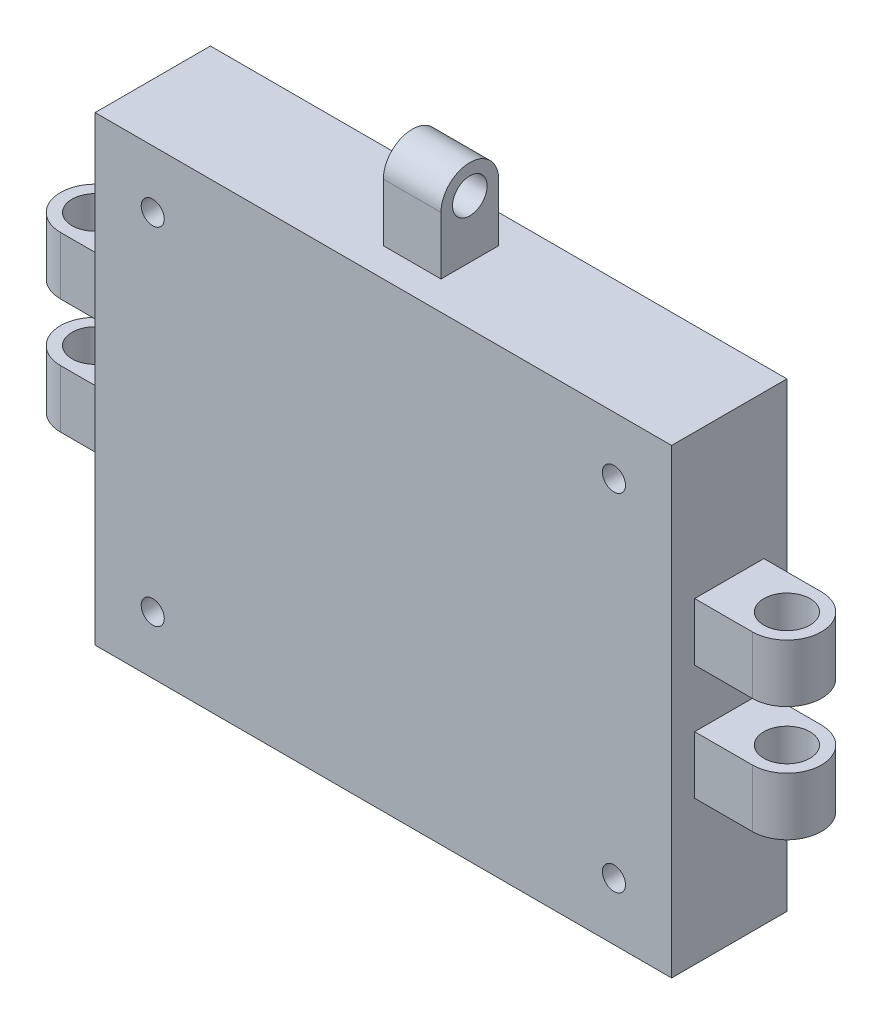
ISO-10303-21;
HEADER;
FILE_DESCRIPTION(('STEP AP214'),'2;1');
FILE_NAME('part.step','',(''),(''),'','','');
FILE_SCHEMA(('AUTOMOTIVE_DESIGN { 1 0 10303 214 1 1 1 1 }'));
ENDSEC;
DATA;
#1=APPLICATION_CONTEXT('core data for automotive mechanical design processes');
#2=APPLICATION_PROTOCOL_DEFINITION('international standard','automotive_design',2000,#1);
#3=PRODUCT_CONTEXT('',#1,'mechanical');
#4=PRODUCT('Part','Part','',(#3));
#5=PRODUCT_RELATED_PRODUCT_CATEGORY('part','',(#4));
#6=PRODUCT_DEFINITION_FORMATION('','',#4);
#7=PRODUCT_DEFINITION_CONTEXT('part definition',#1,'design');
#8=PRODUCT_DEFINITION('design','',#6,#7);
#9=PRODUCT_DEFINITION_SHAPE('','',#8);
#10=(LENGTH_UNIT() NAMED_UNIT(*) SI_UNIT(.MILLI.,.METRE.));
#11=(NAMED_UNIT(*) PLANE_ANGLE_UNIT() SI_UNIT($,.RADIAN.));
#12=(NAMED_UNIT(*) SI_UNIT($,.STERADIAN.) SOLID_ANGLE_UNIT());
#13=UNCERTAINTY_MEASURE_WITH_UNIT(LENGTH_MEASURE(1.E-05),#10,'distance_accuracy_value','');
#14=(GEOMETRIC_REPRESENTATION_CONTEXT(3) GLOBAL_UNCERTAINTY_ASSIGNED_CONTEXT((#13)) GLOBAL_UNIT_ASSIGNED_CONTEXT((#10,
#11,#12)) REPRESENTATION_CONTEXT('',''));
#15=CARTESIAN_POINT('',(0.,0.,0.));
#16=DIRECTION('',(0.,0.,1.));
#17=DIRECTION('',(1.,0.,0.));
#18=AXIS2_PLACEMENT_3D('',#15,#16,#17);
#19=CARTESIAN_POINT('',(-3.96850295792851,467.637931034483,2.5));
#20=DIRECTION('',(1.,0.,0.));
#21=DIRECTION('',(0.,0.,-1.));
#22=AXIS2_PLACEMENT_3D('',#19,#20,#21);
#23=PLANE('',#22);
#24=CARTESIAN_POINT('',(-3.96850295792851,462.637931034483,5.));
#25=DIRECTION('',(1.,0.,0.));
#26=DIRECTION('',(0.,0.,-1.));
#27=AXIS2_PLACEMENT_3D('',#24,#25,#26);
#28=CIRCLE('',#27,1.5);
#29=CARTESIAN_POINT('',(-3.96850295792851,462.637931034483,3.5));
#30=VERTEX_POINT('',#29);
#31=EDGE_CURVE('E493',#30,#30,#28,.T.);
#32=ORIENTED_EDGE('',*,*,#31,.T.);
#33=EDGE_LOOP('',(#32));
#34=FACE_BOUND('',#33,.T.);
#35=CARTESIAN_POINT('',(-3.96850295792851,462.637931034483,5.));
#36=DIRECTION('',(1.,0.,0.));
#37=DIRECTION('',(0.,0.,-1.));
#38=AXIS2_PLACEMENT_3D('',#35,#36,#37);
#39=CIRCLE('',#38,2.5);
#40=CARTESIAN_POINT('',(-3.96850295792851,462.637931034483,2.5));
#41=VERTEX_POINT('',#40);
#42=CARTESIAN_POINT('',(-3.96850295792851,462.637931034483,7.5));
#43=VERTEX_POINT('',#42);
#44=EDGE_CURVE('E202',#41,#43,#39,.T.);
#45=ORIENTED_EDGE('',*,*,#44,.F.);
#46=DIRECTION('',(0.,-1.,0.));
#47=VECTOR('',#46,1.);
#48=CARTESIAN_POINT('',(-3.96850295792851,467.637931034483,2.5));
#49=LINE('',#48,#47);
#50=CARTESIAN_POINT('',(-3.96850295792851,457.637931034483,2.5));
#51=VERTEX_POINT('',#50);
#52=EDGE_CURVE('E229',#41,#51,#49,.T.);
#53=ORIENTED_EDGE('',*,*,#52,.T.);
#54=DIRECTION('',(0.,0.,1.));
#55=VECTOR('',#54,1.);
#56=CARTESIAN_POINT('',(-3.96850295792851,457.637931034483,2.5));
#57=LINE('',#56,#55);
#58=CARTESIAN_POINT('',(-3.96850295792851,457.637931034483,7.5));
#59=VERTEX_POINT('',#58);
#60=EDGE_CURVE('E497',#51,#59,#57,.T.);
#61=ORIENTED_EDGE('',*,*,#60,.T.);
#62=DIRECTION('',(0.,-1.,0.));
#63=VECTOR('',#62,1.);
#64=CARTESIAN_POINT('',(-3.96850295792851,467.637931034483,7.5));
#65=LINE('',#64,#63);
#66=EDGE_CURVE('E223',#43,#59,#65,.T.);
#67=ORIENTED_EDGE('',*,*,#66,.F.);
#68=EDGE_LOOP('',(#45,#53,#61,#67));
#69=FACE_BOUND('',#68,.T.);
#70=ADVANCED_FACE('F40',(#34,#69),#23,.F.);
#71=CARTESIAN_POINT('',(-3.96850295792851,467.637931034483,7.5));
#72=DIRECTION('',(0.,0.,-1.));
#73=DIRECTION('',(-1.,0.,0.));
#74=AXIS2_PLACEMENT_3D('',#71,#72,#73);
#75=PLANE('',#74);
#76=DIRECTION('',(1.,0.,0.));
#77=VECTOR('',#76,1.);
#78=CARTESIAN_POINT('',(-28.9685029579222,462.637931034483,7.50000000000001));
#79=LINE('',#78,#77);
#80=CARTESIAN_POINT('',(1.0314970420778,462.637931034483,7.5));
#81=VERTEX_POINT('',#80);
#82=EDGE_CURVE('E199',#43,#81,#79,.T.);
#83=ORIENTED_EDGE('',*,*,#82,.F.);
#84=ORIENTED_EDGE('',*,*,#66,.T.);
#85=DIRECTION('',(1.,0.,0.));
#86=VECTOR('',#85,1.);
#87=CARTESIAN_POINT('',(-3.96850295792851,457.637931034483,7.5));
#88=LINE('',#87,#86);
#89=CARTESIAN_POINT('',(1.0314970420778,457.637931034483,7.5));
#90=VERTEX_POINT('',#89);
#91=EDGE_CURVE('E221',#59,#90,#88,.T.);
#92=ORIENTED_EDGE('',*,*,#91,.T.);
#93=DIRECTION('',(0.,-1.,0.));
#94=VECTOR('',#93,1.);
#95=CARTESIAN_POINT('',(1.0314970420778,467.637931034483,7.5));
#96=LINE('',#95,#94);
#97=EDGE_CURVE('E213',#81,#90,#96,.T.);
#98=ORIENTED_EDGE('',*,*,#97,.F.);
#99=EDGE_LOOP('',(#83,#84,#92,#98));
#100=FACE_BOUND('',#99,.T.);
#101=ADVANCED_FACE('F219',(#100),#75,.F.);
#102=CARTESIAN_POINT('',(1.0314970420778,467.637931034483,2.5));
#103=DIRECTION('',(-1.,0.,0.));
#104=DIRECTION('',(0.,0.,1.));
#105=AXIS2_PLACEMENT_3D('',#102,#103,#104);
#106=PLANE('',#105);
#107=CARTESIAN_POINT('',(1.0314970420778,462.637931034483,5.));
#108=DIRECTION('',(1.,0.,0.));
#109=DIRECTION('',(0.,0.,-1.));
#110=AXIS2_PLACEMENT_3D('',#107,#108,#109);
#111=CIRCLE('',#110,1.5);
#112=CARTESIAN_POINT('',(1.0314970420778,462.637931034483,3.5));
#113=VERTEX_POINT('',#112);
#114=EDGE_CURVE('E486',#113,#113,#111,.T.);
#115=ORIENTED_EDGE('',*,*,#114,.F.);
#116=EDGE_LOOP('',(#115));
#117=FACE_BOUND('',#116,.T.);
#118=CARTESIAN_POINT('',(1.0314970420778,462.637931034483,5.));
#119=DIRECTION('',(1.,0.,0.));
#120=DIRECTION('',(0.,0.,-1.));
#121=AXIS2_PLACEMENT_3D('',#118,#119,#120);
#122=CIRCLE('',#121,2.5);
#123=CARTESIAN_POINT('',(1.0314970420778,462.637931034483,2.5));
#124=VERTEX_POINT('',#123);
#125=EDGE_CURVE('E56',#124,#81,#122,.T.);
#126=ORIENTED_EDGE('',*,*,#125,.T.);
#127=ORIENTED_EDGE('',*,*,#97,.T.);
#128=DIRECTION('',(0.,0.,-1.));
#129=VECTOR('',#128,1.);
#130=CARTESIAN_POINT('',(1.0314970420778,457.637931034483,2.5));
#131=LINE('',#130,#129);
#132=CARTESIAN_POINT('',(1.0314970420778,457.637931034483,2.5));
#133=VERTEX_POINT('',#132);
#134=EDGE_CURVE('E503',#90,#133,#131,.T.);
#135=ORIENTED_EDGE('',*,*,#134,.T.);
#136=DIRECTION('',(0.,-1.,0.));
#137=VECTOR('',#136,1.);
#138=CARTESIAN_POINT('',(1.0314970420778,467.637931034483,2.5));
#139=LINE('',#138,#137);
#140=EDGE_CURVE('E215',#124,#133,#139,.T.);
#141=ORIENTED_EDGE('',*,*,#140,.F.);
#142=EDGE_LOOP('',(#126,#127,#135,#141));
#143=FACE_BOUND('',#142,.T.);
#144=ADVANCED_FACE('F211',(#117,#143),#106,.F.);
#145=CARTESIAN_POINT('',(-36.4685029579272,440.137931034485,0.));
#146=DIRECTION('',(0.,-1.,0.));
#147=DIRECTION('',(1.,0.,0.));
#148=AXIS2_PLACEMENT_3D('',#145,#146,#147);
#149=PLANE('',#148);
#150=CARTESIAN_POINT('',(-31.4685029579271,440.137931034485,5.00000000000001));
#151=DIRECTION('',(0.,-1.,0.));
#152=DIRECTION('',(1.,0.,0.));
#153=AXIS2_PLACEMENT_3D('',#150,#151,#152);
#154=CIRCLE('',#153,2.);
#155=CARTESIAN_POINT('',(-29.4685029579271,440.137931034485,5.00000000000001));
#156=VERTEX_POINT('',#155);
#157=EDGE_CURVE('E241',#156,#156,#154,.F.);
#158=ORIENTED_EDGE('',*,*,#157,.T.);
#159=EDGE_LOOP('',(#158));
#160=FACE_BOUND('',#159,.T.);
#161=DIRECTION('',(1.,0.,0.));
#162=VECTOR('',#161,1.);
#163=CARTESIAN_POINT('',(-36.4685029579272,440.137931034485,8.));
#164=LINE('',#163,#162);
#165=CARTESIAN_POINT('',(-31.4685029579271,440.137931034485,8.));
#166=VERTEX_POINT('',#165);
#167=CARTESIAN_POINT('',(-26.4685029579271,440.137931034486,8.));
#168=VERTEX_POINT('',#167);
#169=EDGE_CURVE('E295',#166,#168,#164,.T.);
#170=ORIENTED_EDGE('',*,*,#169,.F.);
#171=CARTESIAN_POINT('',(-31.4685029579271,440.137931034485,5.00000000000001));
#172=DIRECTION('',(0.,-1.,0.));
#173=DIRECTION('',(1.,0.,0.));
#174=AXIS2_PLACEMENT_3D('',#171,#172,#173);
#175=CIRCLE('',#174,3.00000000000001);
#176=CARTESIAN_POINT('',(-31.4685029579271,440.137931034485,2.));
#177=VERTEX_POINT('',#176);
#178=EDGE_CURVE('E538',#166,#177,#175,.T.);
#179=ORIENTED_EDGE('',*,*,#178,.T.);
#180=DIRECTION('',(1.,0.,0.));
#181=VECTOR('',#180,1.);
#182=CARTESIAN_POINT('',(-36.4685029579272,440.137931034485,2.));
#183=LINE('',#182,#181);
#184=CARTESIAN_POINT('',(-26.4685029579271,440.137931034486,2.));
#185=VERTEX_POINT('',#184);
#186=EDGE_CURVE('E298',#177,#185,#183,.T.);
#187=ORIENTED_EDGE('',*,*,#186,.T.);
#188=DIRECTION('',(0.,0.,-1.));
#189=VECTOR('',#188,1.);
#190=CARTESIAN_POINT('',(-26.4685029579271,440.137931034486,0.));
#191=LINE('',#190,#189);
#192=EDGE_CURVE('E277',#168,#185,#191,.T.);
#193=ORIENTED_EDGE('',*,*,#192,.F.);
#194=EDGE_LOOP('',(#170,#179,#187,#193));
#195=FACE_BOUND('',#194,.T.);
#196=ADVANCED_FACE('F617',(#160,#195),#149,.T.);
#197=CARTESIAN_POINT('',(-36.4685029579275,445.137931034485,0.));
#198=DIRECTION('',(0.,-1.,0.));
#199=DIRECTION('',(1.,0.,0.));
#200=AXIS2_PLACEMENT_3D('',#197,#198,#199);
#201=PLANE('',#200);
#202=CARTESIAN_POINT('',(-31.4685029579275,445.137931034485,5.00000000000001));
#203=DIRECTION('',(0.,-1.,0.));
#204=DIRECTION('',(1.,0.,0.));
#205=AXIS2_PLACEMENT_3D('',#202,#203,#204);
#206=CIRCLE('',#205,2.);
#207=CARTESIAN_POINT('',(-29.4685029579275,445.137931034485,5.00000000000001));
#208=VERTEX_POINT('',#207);
#209=EDGE_CURVE('E227',#208,#208,#206,.T.);
#210=ORIENTED_EDGE('',*,*,#209,.T.);
#211=EDGE_LOOP('',(#210));
#212=FACE_BOUND('',#211,.T.);
#213=CARTESIAN_POINT('',(-31.4685029579275,445.137931034485,5.00000000000001));
#214=DIRECTION('',(0.,1.,0.));
#215=DIRECTION('',(-1.,0.,0.));
#216=AXIS2_PLACEMENT_3D('',#213,#214,#215);
#217=CIRCLE('',#216,3.00000000000001);
#218=CARTESIAN_POINT('',(-31.4685029579275,445.137931034485,2.));
#219=VERTEX_POINT('',#218);
#220=CARTESIAN_POINT('',(-31.4685029579252,445.137931034485,8.));
#221=VERTEX_POINT('',#220);
#222=EDGE_CURVE('E523',#219,#221,#217,.T.);
#223=ORIENTED_EDGE('',*,*,#222,.T.);
#224=DIRECTION('',(1.,0.,0.));
#225=VECTOR('',#224,1.);
#226=CARTESIAN_POINT('',(-36.4685029579275,445.137931034485,8.));
#227=LINE('',#226,#225);
#228=CARTESIAN_POINT('',(-26.4685029579275,445.137931034486,8.));
#229=VERTEX_POINT('',#228);
#230=EDGE_CURVE('E292',#221,#229,#227,.T.);
#231=ORIENTED_EDGE('',*,*,#230,.T.);
#232=DIRECTION('',(0.,0.,-1.));
#233=VECTOR('',#232,1.);
#234=CARTESIAN_POINT('',(-26.4685029579275,445.137931034486,0.));
#235=LINE('',#234,#233);
#236=CARTESIAN_POINT('',(-26.4685029579275,445.137931034486,2.));
#237=VERTEX_POINT('',#236);
#238=EDGE_CURVE('E285',#229,#237,#235,.T.);
#239=ORIENTED_EDGE('',*,*,#238,.T.);
#240=DIRECTION('',(1.,0.,0.));
#241=VECTOR('',#240,1.);
#242=CARTESIAN_POINT('',(-36.4685029579275,445.137931034485,2.));
#243=LINE('',#242,#241);
#244=EDGE_CURVE('E289',#219,#237,#243,.T.);
#245=ORIENTED_EDGE('',*,*,#244,.F.);
#246=EDGE_LOOP('',(#223,#231,#239,#245));
#247=FACE_BOUND('',#246,.T.);
#248=ADVANCED_FACE('F609',(#212,#247),#201,.F.);
#249=CARTESIAN_POINT('',(-36.4685029579264,430.137931034485,0.));
#250=DIRECTION('',(0.,-1.,0.));
#251=DIRECTION('',(1.,0.,0.));
#252=AXIS2_PLACEMENT_3D('',#249,#250,#251);
#253=PLANE('',#252);
#254=CARTESIAN_POINT('',(-31.4685029579263,430.137931034485,5.00000000000001));
#255=DIRECTION('',(0.,-1.,0.));
#256=DIRECTION('',(1.,0.,0.));
#257=AXIS2_PLACEMENT_3D('',#254,#255,#256);
#258=CIRCLE('',#257,2.);
#259=CARTESIAN_POINT('',(-29.4685029579264,430.137931034485,5.00000000000001));
#260=VERTEX_POINT('',#259);
#261=EDGE_CURVE('E237',#260,#260,#258,.F.);
#262=ORIENTED_EDGE('',*,*,#261,.T.);
#263=EDGE_LOOP('',(#262));
#264=FACE_BOUND('',#263,.T.);
#265=DIRECTION('',(1.,0.,0.));
#266=VECTOR('',#265,1.);
#267=CARTESIAN_POINT('',(-36.4685029579264,430.137931034485,8.));
#268=LINE('',#267,#266);
#269=CARTESIAN_POINT('',(-31.4685029579264,430.137931034485,8.));
#270=VERTEX_POINT('',#269);
#271=CARTESIAN_POINT('',(-26.4685029579264,430.137931034486,8.));
#272=VERTEX_POINT('',#271);
#273=EDGE_CURVE('E267',#270,#272,#268,.T.);
#274=ORIENTED_EDGE('',*,*,#273,.F.);
#275=CARTESIAN_POINT('',(-31.4685029579263,430.137931034485,5.00000000000001));
#276=DIRECTION('',(0.,-1.,0.));
#277=DIRECTION('',(1.,0.,0.));
#278=AXIS2_PLACEMENT_3D('',#275,#276,#277);
#279=CIRCLE('',#278,3.00000000000001);
#280=CARTESIAN_POINT('',(-31.4685029579263,430.137931034485,2.));
#281=VERTEX_POINT('',#280);
#282=EDGE_CURVE('E534',#270,#281,#279,.T.);
#283=ORIENTED_EDGE('',*,*,#282,.T.);
#284=DIRECTION('',(1.,0.,0.));
#285=VECTOR('',#284,1.);
#286=CARTESIAN_POINT('',(-36.4685029579264,430.137931034485,2.));
#287=LINE('',#286,#285);
#288=CARTESIAN_POINT('',(-26.4685029579264,430.137931034486,2.));
#289=VERTEX_POINT('',#288);
#290=EDGE_CURVE('E270',#281,#289,#287,.T.);
#291=ORIENTED_EDGE('',*,*,#290,.T.);
#292=DIRECTION('',(0.,0.,-1.));
#293=VECTOR('',#292,1.);
#294=CARTESIAN_POINT('',(-26.4685029579264,430.137931034486,0.));
#295=LINE('',#294,#293);
#296=EDGE_CURVE('E249',#272,#289,#295,.T.);
#297=ORIENTED_EDGE('',*,*,#296,.F.);
#298=EDGE_LOOP('',(#274,#283,#291,#297));
#299=FACE_BOUND('',#298,.T.);
#300=ADVANCED_FACE('F600',(#264,#299),#253,.T.);
#301=CARTESIAN_POINT('',(-36.4685029579268,435.137931034485,0.));
#302=DIRECTION('',(0.,-1.,0.));
#303=DIRECTION('',(1.,0.,0.));
#304=AXIS2_PLACEMENT_3D('',#301,#302,#303);
#305=PLANE('',#304);
#306=CARTESIAN_POINT('',(-31.4685029579267,435.137931034485,5.00000000000001));
#307=DIRECTION('',(0.,-1.,0.));
#308=DIRECTION('',(1.,0.,0.));
#309=AXIS2_PLACEMENT_3D('',#306,#307,#308);
#310=CIRCLE('',#309,2.);
#311=CARTESIAN_POINT('',(-29.4685029579267,435.137931034485,5.00000000000001));
#312=VERTEX_POINT('',#311);
#313=EDGE_CURVE('E236',#312,#312,#310,.F.);
#314=ORIENTED_EDGE('',*,*,#313,.F.);
#315=EDGE_LOOP('',(#314));
#316=FACE_BOUND('',#315,.T.);
#317=CARTESIAN_POINT('',(-31.4685029579267,435.137931034485,5.00000000000001));
#318=DIRECTION('',(0.,-1.,0.));
#319=DIRECTION('',(1.,0.,0.));
#320=AXIS2_PLACEMENT_3D('',#317,#318,#319);
#321=CIRCLE('',#320,3.00000000000001);
#322=CARTESIAN_POINT('',(-31.4685029579252,435.137931034485,8.));
#323=VERTEX_POINT('',#322);
#324=CARTESIAN_POINT('',(-31.4685029579267,435.137931034485,2.));
#325=VERTEX_POINT('',#324);
#326=EDGE_CURVE('E11',#323,#325,#321,.T.);
#327=ORIENTED_EDGE('',*,*,#326,.F.);
#328=DIRECTION('',(1.,0.,0.));
#329=VECTOR('',#328,1.);
#330=CARTESIAN_POINT('',(-36.4685029579268,435.137931034485,8.));
#331=LINE('',#330,#329);
#332=CARTESIAN_POINT('',(-26.4685029579268,435.137931034486,8.));
#333=VERTEX_POINT('',#332);
#334=EDGE_CURVE('E264',#323,#333,#331,.T.);
#335=ORIENTED_EDGE('',*,*,#334,.T.);
#336=DIRECTION('',(0.,0.,-1.));
#337=VECTOR('',#336,1.);
#338=CARTESIAN_POINT('',(-26.4685029579268,435.137931034486,0.));
#339=LINE('',#338,#337);
#340=CARTESIAN_POINT('',(-26.4685029579268,435.137931034486,2.));
#341=VERTEX_POINT('',#340);
#342=EDGE_CURVE('E257',#333,#341,#339,.T.);
#343=ORIENTED_EDGE('',*,*,#342,.T.);
#344=DIRECTION('',(1.,0.,0.));
#345=VECTOR('',#344,1.);
#346=CARTESIAN_POINT('',(-36.4685029579268,435.137931034485,2.));
#347=LINE('',#346,#345);
#348=EDGE_CURVE('E261',#325,#341,#347,.T.);
#349=ORIENTED_EDGE('',*,*,#348,.F.);
#350=EDGE_LOOP('',(#327,#335,#343,#349));
#351=FACE_BOUND('',#350,.T.);
#352=ADVANCED_FACE('F597',(#316,#351),#305,.F.);
#353=CARTESIAN_POINT('',(33.5314970420768,445.137931034485,0.));
#354=DIRECTION('',(0.,1.,0.));
#355=DIRECTION('',(-1.,0.,0.));
#356=AXIS2_PLACEMENT_3D('',#353,#354,#355);
#357=PLANE('',#356);
#358=CARTESIAN_POINT('',(28.5314970420768,445.137931034485,5.00000000000001));
#359=DIRECTION('',(0.,1.,0.));
#360=DIRECTION('',(-1.,0.,0.));
#361=AXIS2_PLACEMENT_3D('',#358,#359,#360);
#362=CIRCLE('',#361,2.);
#363=CARTESIAN_POINT('',(26.5314970420768,445.137931034485,5.00000000000001));
#364=VERTEX_POINT('',#363);
#365=EDGE_CURVE('E317',#364,#364,#362,.T.);
#366=ORIENTED_EDGE('',*,*,#365,.F.);
#367=EDGE_LOOP('',(#366));
#368=FACE_BOUND('',#367,.T.);
#369=DIRECTION('',(-1.,0.,0.));
#370=VECTOR('',#369,1.);
#371=CARTESIAN_POINT('',(33.5314970420768,445.137931034485,8.));
#372=LINE('',#371,#370);
#373=CARTESIAN_POINT('',(28.5314970420768,445.137931034485,8.));
#374=VERTEX_POINT('',#373);
#375=CARTESIAN_POINT('',(23.5314970420768,445.137931034486,8.));
#376=VERTEX_POINT('',#375);
#377=EDGE_CURVE('E380',#374,#376,#372,.T.);
#378=ORIENTED_EDGE('',*,*,#377,.F.);
#379=CARTESIAN_POINT('',(28.5314970420768,445.137931034485,5.00000000000001));
#380=DIRECTION('',(0.,1.,0.));
#381=DIRECTION('',(-1.,0.,0.));
#382=AXIS2_PLACEMENT_3D('',#379,#380,#381);
#383=CIRCLE('',#382,3.00000000000001);
#384=CARTESIAN_POINT('',(28.5314970420768,445.137931034485,2.));
#385=VERTEX_POINT('',#384);
#386=EDGE_CURVE('E542',#374,#385,#383,.T.);
#387=ORIENTED_EDGE('',*,*,#386,.T.);
#388=DIRECTION('',(-1.,0.,0.));
#389=VECTOR('',#388,1.);
#390=CARTESIAN_POINT('',(33.5314970420768,445.137931034485,2.));
#391=LINE('',#390,#389);
#392=CARTESIAN_POINT('',(23.5314970420768,445.137931034486,2.));
#393=VERTEX_POINT('',#392);
#394=EDGE_CURVE('E383',#385,#393,#391,.T.);
#395=ORIENTED_EDGE('',*,*,#394,.T.);
#396=DIRECTION('',(0.,0.,-1.));
#397=VECTOR('',#396,1.);
#398=CARTESIAN_POINT('',(23.5314970420768,445.137931034486,0.));
#399=LINE('',#398,#397);
#400=EDGE_CURVE('E362',#376,#393,#399,.T.);
#401=ORIENTED_EDGE('',*,*,#400,.F.);
#402=EDGE_LOOP('',(#378,#387,#395,#401));
#403=FACE_BOUND('',#402,.T.);
#404=ADVANCED_FACE('F559',(#368,#403),#357,.T.);
#405=CARTESIAN_POINT('',(33.5314970420764,440.137931034485,0.));
#406=DIRECTION('',(0.,1.,0.));
#407=DIRECTION('',(-1.,0.,0.));
#408=AXIS2_PLACEMENT_3D('',#405,#406,#407);
#409=PLANE('',#408);
#410=CARTESIAN_POINT('',(28.5314970420764,440.137931034485,5.00000000000001));
#411=DIRECTION('',(0.,1.,0.));
#412=DIRECTION('',(-1.,0.,0.));
#413=AXIS2_PLACEMENT_3D('',#410,#411,#412);
#414=CIRCLE('',#413,2.);
#415=CARTESIAN_POINT('',(26.5314970420764,440.137931034485,5.00000000000001));
#416=VERTEX_POINT('',#415);
#417=EDGE_CURVE('E326',#416,#416,#414,.T.);
#418=ORIENTED_EDGE('',*,*,#417,.T.);
#419=EDGE_LOOP('',(#418));
#420=FACE_BOUND('',#419,.T.);
#421=CARTESIAN_POINT('',(28.5314970420764,440.137931034485,5.00000000000001));
#422=DIRECTION('',(0.,1.,0.));
#423=DIRECTION('',(-1.,0.,0.));
#424=AXIS2_PLACEMENT_3D('',#421,#422,#423);
#425=CIRCLE('',#424,3.00000000000001);
#426=CARTESIAN_POINT('',(28.5314970420751,440.137931034485,8.));
#427=VERTEX_POINT('',#426);
#428=CARTESIAN_POINT('',(28.5314970420764,440.137931034485,2.));
#429=VERTEX_POINT('',#428);
#430=EDGE_CURVE('E450',#427,#429,#425,.T.);
#431=ORIENTED_EDGE('',*,*,#430,.F.);
#432=DIRECTION('',(-1.,0.,0.));
#433=VECTOR('',#432,1.);
#434=CARTESIAN_POINT('',(33.5314970420764,440.137931034485,8.));
#435=LINE('',#434,#433);
#436=CARTESIAN_POINT('',(23.5314970420764,440.137931034486,8.));
#437=VERTEX_POINT('',#436);
#438=EDGE_CURVE('E377',#427,#437,#435,.T.);
#439=ORIENTED_EDGE('',*,*,#438,.T.);
#440=DIRECTION('',(0.,0.,-1.));
#441=VECTOR('',#440,1.);
#442=CARTESIAN_POINT('',(23.5314970420764,440.137931034486,0.));
#443=LINE('',#442,#441);
#444=CARTESIAN_POINT('',(23.5314970420764,440.137931034486,2.));
#445=VERTEX_POINT('',#444);
#446=EDGE_CURVE('E370',#437,#445,#443,.T.);
#447=ORIENTED_EDGE('',*,*,#446,.T.);
#448=DIRECTION('',(-1.,0.,0.));
#449=VECTOR('',#448,1.);
#450=CARTESIAN_POINT('',(33.5314970420764,440.137931034485,2.));
#451=LINE('',#450,#449);
#452=EDGE_CURVE('E374',#429,#445,#451,.T.);
#453=ORIENTED_EDGE('',*,*,#452,.F.);
#454=EDGE_LOOP('',(#431,#439,#447,#453));
#455=FACE_BOUND('',#454,.T.);
#456=ADVANCED_FACE('F568',(#420,#455),#409,.F.);
#457=CARTESIAN_POINT('',(33.5314970420761,435.137931034485,0.));
#458=DIRECTION('',(0.,1.,0.));
#459=DIRECTION('',(-1.,0.,0.));
#460=AXIS2_PLACEMENT_3D('',#457,#458,#459);
#461=PLANE('',#460);
#462=CARTESIAN_POINT('',(28.531497042076,435.137931034485,5.00000000000001));
#463=DIRECTION('',(0.,1.,0.));
#464=DIRECTION('',(-1.,0.,0.));
#465=AXIS2_PLACEMENT_3D('',#462,#463,#464);
#466=CIRCLE('',#465,2.);
#467=CARTESIAN_POINT('',(26.531497042076,435.137931034485,5.00000000000001));
#468=VERTEX_POINT('',#467);
#469=EDGE_CURVE('E322',#468,#468,#466,.T.);
#470=ORIENTED_EDGE('',*,*,#469,.F.);
#471=EDGE_LOOP('',(#470));
#472=FACE_BOUND('',#471,.T.);
#473=DIRECTION('',(-1.,0.,0.));
#474=VECTOR('',#473,1.);
#475=CARTESIAN_POINT('',(33.5314970420761,435.137931034485,8.));
#476=LINE('',#475,#474);
#477=CARTESIAN_POINT('',(28.531497042076,435.137931034485,8.));
#478=VERTEX_POINT('',#477);
#479=CARTESIAN_POINT('',(23.5314970420761,435.137931034486,8.));
#480=VERTEX_POINT('',#479);
#481=EDGE_CURVE('E352',#478,#480,#476,.T.);
#482=ORIENTED_EDGE('',*,*,#481,.F.);
#483=CARTESIAN_POINT('',(28.531497042076,435.137931034485,5.00000000000001));
#484=DIRECTION('',(0.,1.,0.));
#485=DIRECTION('',(-1.,0.,0.));
#486=AXIS2_PLACEMENT_3D('',#483,#484,#485);
#487=CIRCLE('',#486,3.00000000000001);
#488=CARTESIAN_POINT('',(28.531497042076,435.137931034485,2.));
#489=VERTEX_POINT('',#488);
#490=EDGE_CURVE('E434',#478,#489,#487,.T.);
#491=ORIENTED_EDGE('',*,*,#490,.T.);
#492=DIRECTION('',(-1.,0.,0.));
#493=VECTOR('',#492,1.);
#494=CARTESIAN_POINT('',(33.5314970420761,435.137931034485,2.));
#495=LINE('',#494,#493);
#496=CARTESIAN_POINT('',(23.5314970420761,435.137931034486,2.));
#497=VERTEX_POINT('',#496);
#498=EDGE_CURVE('E355',#489,#497,#495,.T.);
#499=ORIENTED_EDGE('',*,*,#498,.T.);
#500=DIRECTION('',(0.,0.,-1.));
#501=VECTOR('',#500,1.);
#502=CARTESIAN_POINT('',(23.5314970420761,435.137931034486,0.));
#503=LINE('',#502,#501);
#504=EDGE_CURVE('E334',#480,#497,#503,.T.);
#505=ORIENTED_EDGE('',*,*,#504,.F.);
#506=EDGE_LOOP('',(#482,#491,#499,#505));
#507=FACE_BOUND('',#506,.T.);
#508=ADVANCED_FACE('F448',(#472,#507),#461,.T.);
#509=CARTESIAN_POINT('',(33.5314970420757,430.137931034485,0.));
#510=DIRECTION('',(0.,1.,0.));
#511=DIRECTION('',(-1.,0.,0.));
#512=AXIS2_PLACEMENT_3D('',#509,#510,#511);
#513=PLANE('',#512);
#514=CARTESIAN_POINT('',(28.5314970420756,430.137931034485,5.00000000000001));
#515=DIRECTION('',(0.,1.,0.));
#516=DIRECTION('',(-1.,0.,0.));
#517=AXIS2_PLACEMENT_3D('',#514,#515,#516);
#518=CIRCLE('',#517,2.);
#519=CARTESIAN_POINT('',(26.5314970420756,430.137931034485,5.00000000000001));
#520=VERTEX_POINT('',#519);
#521=EDGE_CURVE('E321',#520,#520,#518,.T.);
#522=ORIENTED_EDGE('',*,*,#521,.T.);
#523=EDGE_LOOP('',(#522));
#524=FACE_BOUND('',#523,.T.);
#525=CARTESIAN_POINT('',(28.5314970420756,430.137931034485,5.00000000000001));
#526=DIRECTION('',(0.,1.,0.));
#527=DIRECTION('',(-1.,0.,0.));
#528=AXIS2_PLACEMENT_3D('',#525,#526,#527);
#529=CIRCLE('',#528,3.00000000000001);
#530=CARTESIAN_POINT('',(28.5314970420751,430.137931034485,8.));
#531=VERTEX_POINT('',#530);
#532=CARTESIAN_POINT('',(28.5314970420756,430.137931034485,2.));
#533=VERTEX_POINT('',#532);
#534=EDGE_CURVE('E49',#531,#533,#529,.T.);
#535=ORIENTED_EDGE('',*,*,#534,.F.);
#536=DIRECTION('',(-1.,0.,0.));
#537=VECTOR('',#536,1.);
#538=CARTESIAN_POINT('',(33.5314970420757,430.137931034485,8.));
#539=LINE('',#538,#537);
#540=CARTESIAN_POINT('',(23.5314970420757,430.137931034486,8.));
#541=VERTEX_POINT('',#540);
#542=EDGE_CURVE('E349',#531,#541,#539,.T.);
#543=ORIENTED_EDGE('',*,*,#542,.T.);
#544=DIRECTION('',(0.,0.,-1.));
#545=VECTOR('',#544,1.);
#546=CARTESIAN_POINT('',(23.5314970420757,430.137931034486,0.));
#547=LINE('',#546,#545);
#548=CARTESIAN_POINT('',(23.5314970420757,430.137931034486,2.));
#549=VERTEX_POINT('',#548);
#550=EDGE_CURVE('E342',#541,#549,#547,.T.);
#551=ORIENTED_EDGE('',*,*,#550,.T.);
#552=DIRECTION('',(-1.,0.,0.));
#553=VECTOR('',#552,1.);
#554=CARTESIAN_POINT('',(33.5314970420757,430.137931034485,2.));
#555=LINE('',#554,#553);
#556=EDGE_CURVE('E346',#533,#549,#555,.T.);
#557=ORIENTED_EDGE('',*,*,#556,.F.);
#558=EDGE_LOOP('',(#535,#543,#551,#557));
#559=FACE_BOUND('',#558,.T.);
#560=ADVANCED_FACE('F437',(#524,#559),#513,.F.);
#561=CARTESIAN_POINT('',(-26.4685029579254,457.637931034483,10.));
#562=DIRECTION('',(0.,-1.,0.));
#563=DIRECTION('',(0.,0.,-1.));
#564=AXIS2_PLACEMENT_3D('',#561,#562,#563);
#565=PLANE('',#564);
#566=DIRECTION('',(-1.,0.,0.));
#567=VECTOR('',#566,1.);
#568=CARTESIAN_POINT('',(-26.4685029579254,457.637931034483,0.));
#569=LINE('',#568,#567);
#570=CARTESIAN_POINT('',(23.5314970420778,457.637931034483,0.));
#571=VERTEX_POINT('',#570);
#572=CARTESIAN_POINT('',(-26.4685029579285,457.637931034483,0.));
#573=VERTEX_POINT('',#572);
#574=EDGE_CURVE('E391',#571,#573,#569,.T.);
#575=ORIENTED_EDGE('',*,*,#574,.T.);
#576=DIRECTION('',(0.,0.,-1.));
#577=VECTOR('',#576,1.);
#578=CARTESIAN_POINT('',(-26.4685029579285,457.637931034483,10.));
#579=LINE('',#578,#577);
#580=CARTESIAN_POINT('',(-26.4685029579285,457.637931034483,10.));
#581=VERTEX_POINT('',#580);
#582=EDGE_CURVE('E313',#581,#573,#579,.T.);
#583=ORIENTED_EDGE('',*,*,#582,.F.);
#584=DIRECTION('',(-1.,0.,0.));
#585=VECTOR('',#584,1.);
#586=CARTESIAN_POINT('',(-26.4685029579254,457.637931034483,10.));
#587=LINE('',#586,#585);
#588=CARTESIAN_POINT('',(23.5314970420778,457.637931034483,10.));
#589=VERTEX_POINT('',#588);
#590=EDGE_CURVE('E394',#589,#581,#587,.T.);
#591=ORIENTED_EDGE('',*,*,#590,.F.);
#592=DIRECTION('',(0.,0.,-1.));
#593=VECTOR('',#592,1.);
#594=CARTESIAN_POINT('',(23.5314970420778,457.637931034483,10.));
#595=LINE('',#594,#593);
#596=EDGE_CURVE('E397',#589,#571,#595,.T.);
#597=ORIENTED_EDGE('',*,*,#596,.T.);
#598=EDGE_LOOP('',(#575,#583,#591,#597));
#599=FACE_BOUND('',#598,.T.);
#600=ORIENTED_EDGE('',*,*,#60,.F.);
#601=DIRECTION('',(-1.,0.,0.));
#602=VECTOR('',#601,1.);
#603=CARTESIAN_POINT('',(-3.96850295792851,457.637931034483,2.5));
#604=LINE('',#603,#602);
#605=EDGE_CURVE('E506',#133,#51,#604,.T.);
#606=ORIENTED_EDGE('',*,*,#605,.F.);
#607=ORIENTED_EDGE('',*,*,#134,.F.);
#608=ORIENTED_EDGE('',*,*,#91,.F.);
#609=EDGE_LOOP('',(#600,#606,#607,#608));
#610=FACE_BOUND('',#609,.T.);
#611=ADVANCED_FACE('F516',(#599,#610),#565,.F.);
#612=CARTESIAN_POINT('',(-26.4685029579285,457.637931034483,10.));
#613=DIRECTION('',(-1.,0.,0.));
#614=DIRECTION('',(0.,-1.,0.));
#615=AXIS2_PLACEMENT_3D('',#612,#613,#614);
#616=PLANE('',#615);
#617=DIRECTION('',(0.,1.,0.));
#618=VECTOR('',#617,1.);
#619=CARTESIAN_POINT('',(-26.4685029579285,457.637931034483,0.));
#620=LINE('',#619,#618);
#621=CARTESIAN_POINT('',(-26.4685029579254,417.637931034484,0.));
#622=VERTEX_POINT('',#621);
#623=EDGE_CURVE('E301',#622,#573,#620,.T.);
#624=ORIENTED_EDGE('',*,*,#623,.F.);
#625=DIRECTION('',(0.,0.,-1.));
#626=VECTOR('',#625,1.);
#627=CARTESIAN_POINT('',(-26.4685029579254,417.637931034484,10.));
#628=LINE('',#627,#626);
#629=CARTESIAN_POINT('',(-26.4685029579254,417.637931034484,10.));
#630=VERTEX_POINT('',#629);
#631=EDGE_CURVE('E306',#630,#622,#628,.T.);
#632=ORIENTED_EDGE('',*,*,#631,.F.);
#633=DIRECTION('',(0.,1.,0.));
#634=VECTOR('',#633,1.);
#635=CARTESIAN_POINT('',(-26.4685029579285,457.637931034483,10.));
#636=LINE('',#635,#634);
#637=EDGE_CURVE('E302',#630,#581,#636,.T.);
#638=ORIENTED_EDGE('',*,*,#637,.T.);
#639=ORIENTED_EDGE('',*,*,#582,.T.);
#640=EDGE_LOOP('',(#624,#632,#638,#639));
#641=FACE_BOUND('',#640,.T.);
#642=ORIENTED_EDGE('',*,*,#192,.T.);
#643=DIRECTION('',(0.,-1.,0.));
#644=VECTOR('',#643,1.);
#645=CARTESIAN_POINT('',(-26.4685029578929,-1.82992775139664E-12,2.));
#646=LINE('',#645,#644);
#647=EDGE_CURVE('E273',#237,#185,#646,.T.);
#648=ORIENTED_EDGE('',*,*,#647,.F.);
#649=ORIENTED_EDGE('',*,*,#238,.F.);
#650=DIRECTION('',(0.,-1.,0.));
#651=VECTOR('',#650,1.);
#652=CARTESIAN_POINT('',(-26.4685029578929,-1.82992775139664E-12,8.));
#653=LINE('',#652,#651);
#654=EDGE_CURVE('E281',#229,#168,#653,.T.);
#655=ORIENTED_EDGE('',*,*,#654,.T.);
#656=EDGE_LOOP('',(#642,#648,#649,#655));
#657=FACE_BOUND('',#656,.T.);
#658=ORIENTED_EDGE('',*,*,#296,.T.);
#659=DIRECTION('',(0.,-1.,0.));
#660=VECTOR('',#659,1.);
#661=CARTESIAN_POINT('',(-26.4685029578929,-1.82992775139664E-12,2.));
#662=LINE('',#661,#660);
#663=EDGE_CURVE('E245',#341,#289,#662,.T.);
#664=ORIENTED_EDGE('',*,*,#663,.F.);
#665=ORIENTED_EDGE('',*,*,#342,.F.);
#666=DIRECTION('',(0.,-1.,0.));
#667=VECTOR('',#666,1.);
#668=CARTESIAN_POINT('',(-26.4685029578929,-1.82992775139664E-12,8.));
#669=LINE('',#668,#667);
#670=EDGE_CURVE('E253',#333,#272,#669,.T.);
#671=ORIENTED_EDGE('',*,*,#670,.T.);
#672=EDGE_LOOP('',(#658,#664,#665,#671));
#673=FACE_BOUND('',#672,.T.);
#674=ADVANCED_FACE('F630',(#641,#657,#673),#616,.T.);
#675=CARTESIAN_POINT('',(-26.4685029579254,417.637931034484,10.));
#676=DIRECTION('',(0.,1.,0.));
#677=DIRECTION('',(0.,0.,1.));
#678=AXIS2_PLACEMENT_3D('',#675,#676,#677);
#679=PLANE('',#678);
#680=DIRECTION('',(1.,0.,0.));
#681=VECTOR('',#680,1.);
#682=CARTESIAN_POINT('',(-26.4685029579254,417.637931034484,10.));
#683=LINE('',#682,#681);
#684=CARTESIAN_POINT('',(23.5314970420747,417.637931034484,10.));
#685=VERTEX_POINT('',#684);
#686=EDGE_CURVE('E387',#630,#685,#683,.T.);
#687=ORIENTED_EDGE('',*,*,#686,.F.);
#688=ORIENTED_EDGE('',*,*,#631,.T.);
#689=DIRECTION('',(1.,0.,0.));
#690=VECTOR('',#689,1.);
#691=CARTESIAN_POINT('',(-26.4685029579254,417.637931034484,0.));
#692=LINE('',#691,#690);
#693=CARTESIAN_POINT('',(23.5314970420747,417.637931034484,0.));
#694=VERTEX_POINT('',#693);
#695=EDGE_CURVE('E386',#622,#694,#692,.T.);
#696=ORIENTED_EDGE('',*,*,#695,.T.);
#697=DIRECTION('',(0.,0.,-1.));
#698=VECTOR('',#697,1.);
#699=CARTESIAN_POINT('',(23.5314970420747,417.637931034484,10.));
#700=LINE('',#699,#698);
#701=EDGE_CURVE('E408',#685,#694,#700,.T.);
#702=ORIENTED_EDGE('',*,*,#701,.F.);
#703=EDGE_LOOP('',(#687,#688,#696,#702));
#704=FACE_BOUND('',#703,.T.);
#705=ADVANCED_FACE('F42',(#704),#679,.F.);
#706=CARTESIAN_POINT('',(23.5314970420778,457.637931034483,10.));
#707=DIRECTION('',(-1.,0.,0.));
#708=DIRECTION('',(0.,-1.,0.));
#709=AXIS2_PLACEMENT_3D('',#706,#707,#708);
#710=PLANE('',#709);
#711=ORIENTED_EDGE('',*,*,#504,.T.);
#712=DIRECTION('',(0.,-1.,0.));
#713=VECTOR('',#712,1.);
#714=CARTESIAN_POINT('',(23.5314970420422,-1.82992775139664E-12,2.));
#715=LINE('',#714,#713);
#716=EDGE_CURVE('E330',#497,#549,#715,.T.);
#717=ORIENTED_EDGE('',*,*,#716,.T.);
#718=ORIENTED_EDGE('',*,*,#550,.F.);
#719=DIRECTION('',(0.,-1.,0.));
#720=VECTOR('',#719,1.);
#721=CARTESIAN_POINT('',(23.5314970420422,-1.82992775139664E-12,8.));
#722=LINE('',#721,#720);
#723=EDGE_CURVE('E338',#480,#541,#722,.T.);
#724=ORIENTED_EDGE('',*,*,#723,.F.);
#725=EDGE_LOOP('',(#711,#717,#718,#724));
#726=FACE_BOUND('',#725,.T.);
#727=ORIENTED_EDGE('',*,*,#400,.T.);
#728=DIRECTION('',(0.,-1.,0.));
#729=VECTOR('',#728,1.);
#730=CARTESIAN_POINT('',(23.5314970420422,-1.82992775139664E-12,2.));
#731=LINE('',#730,#729);
#732=EDGE_CURVE('E358',#393,#445,#731,.T.);
#733=ORIENTED_EDGE('',*,*,#732,.T.);
#734=ORIENTED_EDGE('',*,*,#446,.F.);
#735=DIRECTION('',(0.,-1.,0.));
#736=VECTOR('',#735,1.);
#737=CARTESIAN_POINT('',(23.5314970420422,-1.82992775139664E-12,8.));
#738=LINE('',#737,#736);
#739=EDGE_CURVE('E366',#376,#437,#738,.T.);
#740=ORIENTED_EDGE('',*,*,#739,.F.);
#741=EDGE_LOOP('',(#727,#733,#734,#740));
#742=FACE_BOUND('',#741,.T.);
#743=DIRECTION('',(0.,1.,0.));
#744=VECTOR('',#743,1.);
#745=CARTESIAN_POINT('',(23.5314970420778,457.637931034483,0.));
#746=LINE('',#745,#744);
#747=EDGE_CURVE('E400',#694,#571,#746,.T.);
#748=ORIENTED_EDGE('',*,*,#747,.T.);
#749=ORIENTED_EDGE('',*,*,#596,.F.);
#750=DIRECTION('',(0.,1.,0.));
#751=VECTOR('',#750,1.);
#752=CARTESIAN_POINT('',(23.5314970420778,457.637931034483,10.));
#753=LINE('',#752,#751);
#754=EDGE_CURVE('E390',#685,#589,#753,.T.);
#755=ORIENTED_EDGE('',*,*,#754,.F.);
#756=ORIENTED_EDGE('',*,*,#701,.T.);
#757=EDGE_LOOP('',(#748,#749,#755,#756));
#758=FACE_BOUND('',#757,.T.);
#759=ADVANCED_FACE('F441',(#726,#742,#758),#710,.F.);
#760=CARTESIAN_POINT('',(0.,0.,10.));
#761=DIRECTION('',(0.,0.,1.));
#762=DIRECTION('',(1.,0.,0.));
#763=AXIS2_PLACEMENT_3D('',#760,#761,#762);
#764=PLANE('',#763);
#765=CARTESIAN_POINT('',(-21.4685029579254,422.637931034484,10.));
#766=DIRECTION('',(0.,0.,1.));
#767=DIRECTION('',(1.,0.,0.));
#768=AXIS2_PLACEMENT_3D('',#765,#766,#767);
#769=CIRCLE('',#768,1.);
#770=CARTESIAN_POINT('',(-20.4685029579254,422.637931034484,10.));
#771=VERTEX_POINT('',#770);
#772=EDGE_CURVE('E471',#771,#771,#769,.T.);
#773=ORIENTED_EDGE('',*,*,#772,.F.);
#774=EDGE_LOOP('',(#773));
#775=FACE_BOUND('',#774,.T.);
#776=CARTESIAN_POINT('',(18.5314970420747,452.637931034483,10.));
#777=DIRECTION('',(0.,0.,1.));
#778=DIRECTION('',(1.,0.,0.));
#779=AXIS2_PLACEMENT_3D('',#776,#777,#778);
#780=CIRCLE('',#779,1.);
#781=CARTESIAN_POINT('',(19.5314970420747,452.637931034483,10.));
#782=VERTEX_POINT('',#781);
#783=EDGE_CURVE('E462',#782,#782,#780,.T.);
#784=ORIENTED_EDGE('',*,*,#783,.F.);
#785=EDGE_LOOP('',(#784));
#786=FACE_BOUND('',#785,.T.);
#787=CARTESIAN_POINT('',(18.5314970420747,422.637931034484,10.));
#788=DIRECTION('',(0.,0.,1.));
#789=DIRECTION('',(1.,0.,0.));
#790=AXIS2_PLACEMENT_3D('',#787,#788,#789);
#791=CIRCLE('',#790,1.);
#792=CARTESIAN_POINT('',(19.5314970420747,422.637931034484,10.));
#793=VERTEX_POINT('',#792);
#794=EDGE_CURVE('E453',#793,#793,#791,.T.);
#795=ORIENTED_EDGE('',*,*,#794,.F.);
#796=EDGE_LOOP('',(#795));
#797=FACE_BOUND('',#796,.T.);
#798=CARTESIAN_POINT('',(-21.4685029579254,452.637931034483,10.));
#799=DIRECTION('',(0.,0.,1.));
#800=DIRECTION('',(1.,0.,0.));
#801=AXIS2_PLACEMENT_3D('',#798,#799,#800);
#802=CIRCLE('',#801,1.);
#803=CARTESIAN_POINT('',(-20.4685029579254,452.637931034483,10.));
#804=VERTEX_POINT('',#803);
#805=EDGE_CURVE('E470',#804,#804,#802,.T.);
#806=ORIENTED_EDGE('',*,*,#805,.F.);
#807=EDGE_LOOP('',(#806));
#808=FACE_BOUND('',#807,.T.);
#809=ORIENTED_EDGE('',*,*,#590,.T.);
#810=ORIENTED_EDGE('',*,*,#637,.F.);
#811=ORIENTED_EDGE('',*,*,#686,.T.);
#812=ORIENTED_EDGE('',*,*,#754,.T.);
#813=EDGE_LOOP('',(#809,#810,#811,#812));
#814=FACE_BOUND('',#813,.T.);
#815=ADVANCED_FACE('F659',(#775,#786,#797,#808,#814),#764,.T.);
#816=CARTESIAN_POINT('',(0.,0.,0.));
#817=DIRECTION('',(0.,0.,1.));
#818=DIRECTION('',(1.,0.,0.));
#819=AXIS2_PLACEMENT_3D('',#816,#817,#818);
#820=PLANE('',#819);
#821=CARTESIAN_POINT('',(-21.4685029579254,422.637931034484,0.));
#822=DIRECTION('',(0.,0.,1.));
#823=DIRECTION('',(1.,0.,0.));
#824=AXIS2_PLACEMENT_3D('',#821,#822,#823);
#825=CIRCLE('',#824,1.);
#826=CARTESIAN_POINT('',(-20.4685029579254,422.637931034484,0.));
#827=VERTEX_POINT('',#826);
#828=EDGE_CURVE('E466',#827,#827,#825,.T.);
#829=ORIENTED_EDGE('',*,*,#828,.T.);
#830=EDGE_LOOP('',(#829));
#831=FACE_BOUND('',#830,.T.);
#832=CARTESIAN_POINT('',(18.5314970420747,452.637931034483,0.));
#833=DIRECTION('',(0.,0.,1.));
#834=DIRECTION('',(1.,0.,0.));
#835=AXIS2_PLACEMENT_3D('',#832,#833,#834);
#836=CIRCLE('',#835,1.);
#837=CARTESIAN_POINT('',(19.5314970420747,452.637931034483,0.));
#838=VERTEX_POINT('',#837);
#839=EDGE_CURVE('E475',#838,#838,#836,.T.);
#840=ORIENTED_EDGE('',*,*,#839,.T.);
#841=EDGE_LOOP('',(#840));
#842=FACE_BOUND('',#841,.T.);
#843=CARTESIAN_POINT('',(18.5314970420747,422.637931034484,0.));
#844=DIRECTION('',(0.,0.,1.));
#845=DIRECTION('',(1.,0.,0.));
#846=AXIS2_PLACEMENT_3D('',#843,#844,#845);
#847=CIRCLE('',#846,1.);
#848=CARTESIAN_POINT('',(19.5314970420747,422.637931034484,0.));
#849=VERTEX_POINT('',#848);
#850=EDGE_CURVE('E458',#849,#849,#847,.T.);
#851=ORIENTED_EDGE('',*,*,#850,.T.);
#852=EDGE_LOOP('',(#851));
#853=FACE_BOUND('',#852,.T.);
#854=CARTESIAN_POINT('',(-21.4685029579254,452.637931034483,0.));
#855=DIRECTION('',(0.,0.,1.));
#856=DIRECTION('',(1.,0.,0.));
#857=AXIS2_PLACEMENT_3D('',#854,#855,#856);
#858=CIRCLE('',#857,1.);
#859=CARTESIAN_POINT('',(-20.4685029579254,452.637931034483,0.));
#860=VERTEX_POINT('',#859);
#861=EDGE_CURVE('E482',#860,#860,#858,.T.);
#862=ORIENTED_EDGE('',*,*,#861,.T.);
#863=EDGE_LOOP('',(#862));
#864=FACE_BOUND('',#863,.T.);
#865=ORIENTED_EDGE('',*,*,#695,.F.);
#866=ORIENTED_EDGE('',*,*,#623,.T.);
#867=ORIENTED_EDGE('',*,*,#574,.F.);
#868=ORIENTED_EDGE('',*,*,#747,.F.);
#869=EDGE_LOOP('',(#865,#866,#867,#868));
#870=FACE_BOUND('',#869,.T.);
#871=ADVANCED_FACE('F658',(#831,#842,#853,#864,#870),#820,.F.);
#872=CARTESIAN_POINT('',(33.5314970420422,-2.60708386863427E-12,2.));
#873=DIRECTION('',(0.,0.,-1.));
#874=DIRECTION('',(-1.,0.,0.));
#875=AXIS2_PLACEMENT_3D('',#872,#873,#874);
#876=PLANE('',#875);
#877=DIRECTION('',(0.,1.,0.));
#878=VECTOR('',#877,1.);
#879=CARTESIAN_POINT('',(28.5314970420751,423.137931034485,2.));
#880=LINE('',#879,#878);
#881=EDGE_CURVE('E435',#429,#385,#880,.T.);
#882=ORIENTED_EDGE('',*,*,#881,.F.);
#883=ORIENTED_EDGE('',*,*,#452,.T.);
#884=ORIENTED_EDGE('',*,*,#732,.F.);
#885=ORIENTED_EDGE('',*,*,#394,.F.);
#886=EDGE_LOOP('',(#882,#883,#884,#885));
#887=FACE_BOUND('',#886,.T.);
#888=ADVANCED_FACE('F565',(#887),#876,.T.);
#889=CARTESIAN_POINT('',(33.5314970420422,-2.60708386863427E-12,8.));
#890=DIRECTION('',(0.,0.,-1.));
#891=DIRECTION('',(-1.,0.,0.));
#892=AXIS2_PLACEMENT_3D('',#889,#890,#891);
#893=PLANE('',#892);
#894=ORIENTED_EDGE('',*,*,#438,.F.);
#895=DIRECTION('',(0.,1.,0.));
#896=VECTOR('',#895,1.);
#897=CARTESIAN_POINT('',(28.5314970420751,423.137931034485,8.));
#898=LINE('',#897,#896);
#899=EDGE_CURVE('E456',#427,#374,#898,.T.);
#900=ORIENTED_EDGE('',*,*,#899,.T.);
#901=ORIENTED_EDGE('',*,*,#377,.T.);
#902=ORIENTED_EDGE('',*,*,#739,.T.);
#903=EDGE_LOOP('',(#894,#900,#901,#902));
#904=FACE_BOUND('',#903,.T.);
#905=ADVANCED_FACE('F554',(#904),#893,.F.);
#906=CARTESIAN_POINT('',(33.5314970420422,-2.60708386863427E-12,2.));
#907=DIRECTION('',(0.,0.,-1.));
#908=DIRECTION('',(-1.,0.,0.));
#909=AXIS2_PLACEMENT_3D('',#906,#907,#908);
#910=PLANE('',#909);
#911=EDGE_CURVE('E422',#533,#489,#880,.T.);
#912=ORIENTED_EDGE('',*,*,#911,.F.);
#913=ORIENTED_EDGE('',*,*,#556,.T.);
#914=ORIENTED_EDGE('',*,*,#716,.F.);
#915=ORIENTED_EDGE('',*,*,#498,.F.);
#916=EDGE_LOOP('',(#912,#913,#914,#915));
#917=FACE_BOUND('',#916,.T.);
#918=ADVANCED_FACE('F431',(#917),#910,.T.);
#919=CARTESIAN_POINT('',(33.5314970420422,-2.60708386863427E-12,8.));
#920=DIRECTION('',(0.,0.,-1.));
#921=DIRECTION('',(-1.,0.,0.));
#922=AXIS2_PLACEMENT_3D('',#919,#920,#921);
#923=PLANE('',#922);
#924=ORIENTED_EDGE('',*,*,#542,.F.);
#925=EDGE_CURVE('E425',#531,#478,#898,.T.);
#926=ORIENTED_EDGE('',*,*,#925,.T.);
#927=ORIENTED_EDGE('',*,*,#481,.T.);
#928=ORIENTED_EDGE('',*,*,#723,.T.);
#929=EDGE_LOOP('',(#924,#926,#927,#928));
#930=FACE_BOUND('',#929,.T.);
#931=ADVANCED_FACE('F445',(#930),#923,.F.);
#932=CARTESIAN_POINT('',(28.5314970420752,425.137931034485,5.00000000000001));
#933=DIRECTION('',(0.,1.,0.));
#934=DIRECTION('',(-1.,0.,0.));
#935=AXIS2_PLACEMENT_3D('',#932,#933,#934);
#936=CYLINDRICAL_SURFACE('',#935,2.);
#937=ORIENTED_EDGE('',*,*,#469,.T.);
#938=EDGE_LOOP('',(#937));
#939=FACE_BOUND('',#938,.T.);
#940=ORIENTED_EDGE('',*,*,#521,.F.);
#941=EDGE_LOOP('',(#940));
#942=FACE_BOUND('',#941,.T.);
#943=ADVANCED_FACE('F636',(#939,#942),#936,.F.);
#944=ORIENTED_EDGE('',*,*,#365,.T.);
#945=EDGE_LOOP('',(#944));
#946=FACE_BOUND('',#945,.T.);
#947=ORIENTED_EDGE('',*,*,#417,.F.);
#948=EDGE_LOOP('',(#947));
#949=FACE_BOUND('',#948,.T.);
#950=ADVANCED_FACE('F628',(#946,#949),#936,.F.);
#951=CARTESIAN_POINT('',(-36.4685029578929,-2.60708386863427E-12,2.));
#952=DIRECTION('',(0.,0.,1.));
#953=DIRECTION('',(1.,0.,0.));
#954=AXIS2_PLACEMENT_3D('',#951,#952,#953);
#955=PLANE('',#954);
#956=ORIENTED_EDGE('',*,*,#186,.F.);
#957=DIRECTION('',(0.,1.,0.));
#958=VECTOR('',#957,1.);
#959=CARTESIAN_POINT('',(-31.4685029579252,415.137931034485,2.));
#960=LINE('',#959,#958);
#961=EDGE_CURVE('E526',#177,#219,#960,.T.);
#962=ORIENTED_EDGE('',*,*,#961,.T.);
#963=ORIENTED_EDGE('',*,*,#244,.T.);
#964=ORIENTED_EDGE('',*,*,#647,.T.);
#965=EDGE_LOOP('',(#956,#962,#963,#964));
#966=FACE_BOUND('',#965,.T.);
#967=ADVANCED_FACE('F621',(#966),#955,.F.);
#968=CARTESIAN_POINT('',(-36.4685029578929,-2.60708386863427E-12,8.));
#969=DIRECTION('',(0.,0.,1.));
#970=DIRECTION('',(1.,0.,0.));
#971=AXIS2_PLACEMENT_3D('',#968,#969,#970);
#972=PLANE('',#971);
#973=DIRECTION('',(0.,1.,0.));
#974=VECTOR('',#973,1.);
#975=CARTESIAN_POINT('',(-31.4685029579252,415.137931034485,8.));
#976=LINE('',#975,#974);
#977=EDGE_CURVE('E64',#166,#221,#976,.T.);
#978=ORIENTED_EDGE('',*,*,#977,.F.);
#979=ORIENTED_EDGE('',*,*,#169,.T.);
#980=ORIENTED_EDGE('',*,*,#654,.F.);
#981=ORIENTED_EDGE('',*,*,#230,.F.);
#982=EDGE_LOOP('',(#978,#979,#980,#981));
#983=FACE_BOUND('',#982,.T.);
#984=ADVANCED_FACE('F613',(#983),#972,.T.);
#985=CARTESIAN_POINT('',(-36.4685029578929,-2.60708386863427E-12,2.));
#986=DIRECTION('',(0.,0.,1.));
#987=DIRECTION('',(1.,0.,0.));
#988=AXIS2_PLACEMENT_3D('',#985,#986,#987);
#989=PLANE('',#988);
#990=ORIENTED_EDGE('',*,*,#290,.F.);
#991=EDGE_CURVE('E530',#281,#325,#960,.T.);
#992=ORIENTED_EDGE('',*,*,#991,.T.);
#993=ORIENTED_EDGE('',*,*,#348,.T.);
#994=ORIENTED_EDGE('',*,*,#663,.T.);
#995=EDGE_LOOP('',(#990,#992,#993,#994));
#996=FACE_BOUND('',#995,.T.);
#997=ADVANCED_FACE('F605',(#996),#989,.F.);
#998=CARTESIAN_POINT('',(-36.4685029578929,-2.60708386863427E-12,8.));
#999=DIRECTION('',(0.,0.,1.));
#1000=DIRECTION('',(1.,0.,0.));
#1001=AXIS2_PLACEMENT_3D('',#998,#999,#1000);
#1002=PLANE('',#1001);
#1003=EDGE_CURVE('E529',#270,#323,#976,.T.);
#1004=ORIENTED_EDGE('',*,*,#1003,.F.);
#1005=ORIENTED_EDGE('',*,*,#273,.T.);
#1006=ORIENTED_EDGE('',*,*,#670,.F.);
#1007=ORIENTED_EDGE('',*,*,#334,.F.);
#1008=EDGE_LOOP('',(#1004,#1005,#1006,#1007));
#1009=FACE_BOUND('',#1008,.T.);
#1010=ADVANCED_FACE('F602',(#1009),#1002,.T.);
#1011=CARTESIAN_POINT('',(-31.468502957926,425.137931034485,5.00000000000001));
#1012=DIRECTION('',(0.,1.,0.));
#1013=DIRECTION('',(-1.,0.,0.));
#1014=AXIS2_PLACEMENT_3D('',#1011,#1012,#1013);
#1015=CYLINDRICAL_SURFACE('',#1014,2.);
#1016=ORIENTED_EDGE('',*,*,#261,.F.);
#1017=EDGE_LOOP('',(#1016));
#1018=FACE_BOUND('',#1017,.T.);
#1019=ORIENTED_EDGE('',*,*,#313,.T.);
#1020=EDGE_LOOP('',(#1019));
#1021=FACE_BOUND('',#1020,.T.);
#1022=ADVANCED_FACE('F595',(#1018,#1021),#1015,.F.);
#1023=ORIENTED_EDGE('',*,*,#157,.F.);
#1024=EDGE_LOOP('',(#1023));
#1025=FACE_BOUND('',#1024,.T.);
#1026=ORIENTED_EDGE('',*,*,#209,.F.);
#1027=EDGE_LOOP('',(#1026));
#1028=FACE_BOUND('',#1027,.T.);
#1029=ADVANCED_FACE('F592',(#1025,#1028),#1015,.F.);
#1030=CARTESIAN_POINT('',(-3.96850295792851,467.637931034483,2.5));
#1031=DIRECTION('',(0.,0.,1.));
#1032=DIRECTION('',(1.,0.,0.));
#1033=AXIS2_PLACEMENT_3D('',#1030,#1031,#1032);
#1034=PLANE('',#1033);
#1035=ORIENTED_EDGE('',*,*,#52,.F.);
#1036=DIRECTION('',(1.,0.,0.));
#1037=VECTOR('',#1036,1.);
#1038=CARTESIAN_POINT('',(-28.9685029579222,462.637931034483,2.50000000000001));
#1039=LINE('',#1038,#1037);
#1040=EDGE_CURVE('E207',#41,#124,#1039,.T.);
#1041=ORIENTED_EDGE('',*,*,#1040,.T.);
#1042=ORIENTED_EDGE('',*,*,#140,.T.);
#1043=ORIENTED_EDGE('',*,*,#605,.T.);
#1044=EDGE_LOOP('',(#1035,#1041,#1042,#1043));
#1045=FACE_BOUND('',#1044,.T.);
#1046=ADVANCED_FACE('F517',(#1045),#1034,.F.);
#1047=CARTESIAN_POINT('',(-8.9685029579222,462.637931034483,5.));
#1048=DIRECTION('',(1.,0.,0.));
#1049=DIRECTION('',(0.,0.,-1.));
#1050=AXIS2_PLACEMENT_3D('',#1047,#1048,#1049);
#1051=CYLINDRICAL_SURFACE('',#1050,1.5);
#1052=ORIENTED_EDGE('',*,*,#114,.T.);
#1053=EDGE_LOOP('',(#1052));
#1054=FACE_BOUND('',#1053,.T.);
#1055=ORIENTED_EDGE('',*,*,#31,.F.);
#1056=EDGE_LOOP('',(#1055));
#1057=FACE_BOUND('',#1056,.T.);
#1058=ADVANCED_FACE('F729',(#1054,#1057),#1051,.F.);
#1059=CARTESIAN_POINT('',(-21.4685029579254,452.637931034483,0.));
#1060=DIRECTION('',(0.,0.,1.));
#1061=DIRECTION('',(1.,0.,0.));
#1062=AXIS2_PLACEMENT_3D('',#1059,#1060,#1061);
#1063=CYLINDRICAL_SURFACE('',#1062,1.);
#1064=ORIENTED_EDGE('',*,*,#861,.F.);
#1065=EDGE_LOOP('',(#1064));
#1066=FACE_BOUND('',#1065,.T.);
#1067=ORIENTED_EDGE('',*,*,#805,.T.);
#1068=EDGE_LOOP('',(#1067));
#1069=FACE_BOUND('',#1068,.T.);
#1070=ADVANCED_FACE('F753',(#1066,#1069),#1063,.F.);
#1071=CARTESIAN_POINT('',(18.5314970420747,422.637931034484,0.));
#1072=DIRECTION('',(0.,0.,1.));
#1073=DIRECTION('',(1.,0.,0.));
#1074=AXIS2_PLACEMENT_3D('',#1071,#1072,#1073);
#1075=CYLINDRICAL_SURFACE('',#1074,1.);
#1076=ORIENTED_EDGE('',*,*,#850,.F.);
#1077=EDGE_LOOP('',(#1076));
#1078=FACE_BOUND('',#1077,.T.);
#1079=ORIENTED_EDGE('',*,*,#794,.T.);
#1080=EDGE_LOOP('',(#1079));
#1081=FACE_BOUND('',#1080,.T.);
#1082=ADVANCED_FACE('F757',(#1078,#1081),#1075,.F.);
#1083=CARTESIAN_POINT('',(18.5314970420747,452.637931034483,0.));
#1084=DIRECTION('',(0.,0.,1.));
#1085=DIRECTION('',(1.,0.,0.));
#1086=AXIS2_PLACEMENT_3D('',#1083,#1084,#1085);
#1087=CYLINDRICAL_SURFACE('',#1086,1.);
#1088=ORIENTED_EDGE('',*,*,#839,.F.);
#1089=EDGE_LOOP('',(#1088));
#1090=FACE_BOUND('',#1089,.T.);
#1091=ORIENTED_EDGE('',*,*,#783,.T.);
#1092=EDGE_LOOP('',(#1091));
#1093=FACE_BOUND('',#1092,.T.);
#1094=ADVANCED_FACE('F765',(#1090,#1093),#1087,.F.);
#1095=CARTESIAN_POINT('',(-21.4685029579254,422.637931034484,0.));
#1096=DIRECTION('',(0.,0.,1.));
#1097=DIRECTION('',(1.,0.,0.));
#1098=AXIS2_PLACEMENT_3D('',#1095,#1096,#1097);
#1099=CYLINDRICAL_SURFACE('',#1098,1.);
#1100=ORIENTED_EDGE('',*,*,#828,.F.);
#1101=EDGE_LOOP('',(#1100));
#1102=FACE_BOUND('',#1101,.T.);
#1103=ORIENTED_EDGE('',*,*,#772,.T.);
#1104=EDGE_LOOP('',(#1103));
#1105=FACE_BOUND('',#1104,.T.);
#1106=ADVANCED_FACE('F580',(#1102,#1105),#1099,.F.);
#1107=CARTESIAN_POINT('',(28.5314970420751,423.137931034485,5.00000000000001));
#1108=DIRECTION('',(0.,1.,0.));
#1109=DIRECTION('',(-1.,0.,0.));
#1110=AXIS2_PLACEMENT_3D('',#1107,#1108,#1109);
#1111=CYLINDRICAL_SURFACE('',#1110,3.00000000000001);
#1112=ORIENTED_EDGE('',*,*,#925,.F.);
#1113=ORIENTED_EDGE('',*,*,#534,.T.);
#1114=ORIENTED_EDGE('',*,*,#911,.T.);
#1115=ORIENTED_EDGE('',*,*,#490,.F.);
#1116=EDGE_LOOP('',(#1112,#1113,#1114,#1115));
#1117=FACE_BOUND('',#1116,.T.);
#1118=ADVANCED_FACE('F421',(#1117),#1111,.T.);
#1119=ORIENTED_EDGE('',*,*,#430,.T.);
#1120=ORIENTED_EDGE('',*,*,#881,.T.);
#1121=ORIENTED_EDGE('',*,*,#386,.F.);
#1122=ORIENTED_EDGE('',*,*,#899,.F.);
#1123=EDGE_LOOP('',(#1119,#1120,#1121,#1122));
#1124=FACE_BOUND('',#1123,.T.);
#1125=ADVANCED_FACE('F569',(#1124),#1111,.T.);
#1126=CARTESIAN_POINT('',(-31.4685029579252,415.137931034485,5.00000000000001));
#1127=DIRECTION('',(0.,1.,0.));
#1128=DIRECTION('',(-1.,0.,0.));
#1129=AXIS2_PLACEMENT_3D('',#1126,#1127,#1128);
#1130=CYLINDRICAL_SURFACE('',#1129,3.00000000000001);
#1131=ORIENTED_EDGE('',*,*,#1003,.T.);
#1132=ORIENTED_EDGE('',*,*,#326,.T.);
#1133=ORIENTED_EDGE('',*,*,#991,.F.);
#1134=ORIENTED_EDGE('',*,*,#282,.F.);
#1135=EDGE_LOOP('',(#1131,#1132,#1133,#1134));
#1136=FACE_BOUND('',#1135,.T.);
#1137=ADVANCED_FACE('F571',(#1136),#1130,.T.);
#1138=ORIENTED_EDGE('',*,*,#977,.T.);
#1139=ORIENTED_EDGE('',*,*,#222,.F.);
#1140=ORIENTED_EDGE('',*,*,#961,.F.);
#1141=ORIENTED_EDGE('',*,*,#178,.F.);
#1142=EDGE_LOOP('',(#1138,#1139,#1140,#1141));
#1143=FACE_BOUND('',#1142,.T.);
#1144=ADVANCED_FACE('F577',(#1143),#1130,.T.);
#1145=CARTESIAN_POINT('',(-28.9685029579222,462.637931034483,5.00000000000001));
#1146=DIRECTION('',(1.,0.,0.));
#1147=DIRECTION('',(0.,0.,-1.));
#1148=AXIS2_PLACEMENT_3D('',#1145,#1146,#1147);
#1149=CYLINDRICAL_SURFACE('',#1148,2.5);
#1150=ORIENTED_EDGE('',*,*,#44,.T.);
#1151=ORIENTED_EDGE('',*,*,#82,.T.);
#1152=ORIENTED_EDGE('',*,*,#125,.F.);
#1153=ORIENTED_EDGE('',*,*,#1040,.F.);
#1154=EDGE_LOOP('',(#1150,#1151,#1152,#1153));
#1155=FACE_BOUND('',#1154,.T.);
#1156=ADVANCED_FACE('F200',(#1155),#1149,.T.);
#1157=CLOSED_SHELL('',(#70,#101,#144,#196,#248,#300,#352,#404,#456,#508,#560,#611,#674,#705,
#759,#815,#871,#888,#905,#918,#931,#943,#950,#967,#984,#997,#1010,#1022,#1029,#1046,#1058,#1070,
#1082,#1094,#1106,#1118,#1125,#1137,#1144,#1156));
#1158=MANIFOLD_SOLID_BREP('B2',#1157);
#1159=ADVANCED_BREP_SHAPE_REPRESENTATION('',(#18,#1158),#14);
#1160=SHAPE_DEFINITION_REPRESENTATION(#9,#1159);
ENDSEC;
END-ISO-10303-21;
